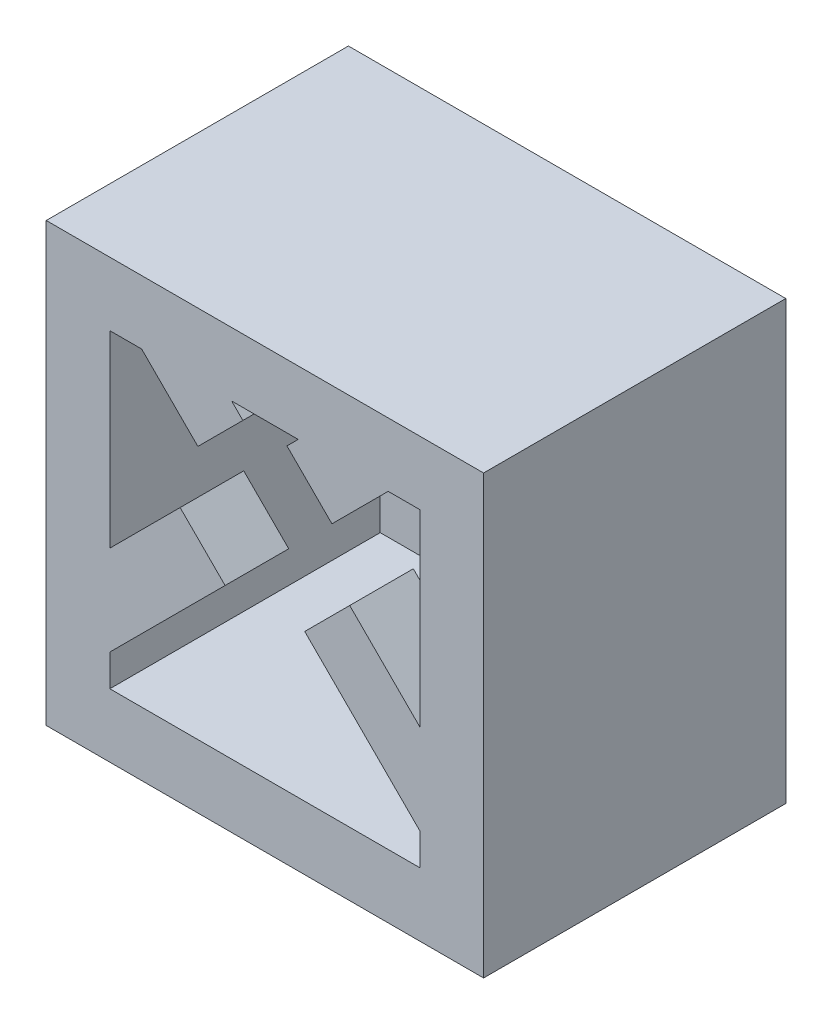
ISO-10303-21;
HEADER;
FILE_DESCRIPTION(('STEP AP214'),'2;1');
FILE_NAME('part.step','',(''),(''),'','','');
FILE_SCHEMA(('AUTOMOTIVE_DESIGN { 1 0 10303 214 1 1 1 1 }'));
ENDSEC;
DATA;
#1=APPLICATION_CONTEXT('core data for automotive mechanical design processes');
#2=APPLICATION_PROTOCOL_DEFINITION('international standard','automotive_design',2000,#1);
#3=PRODUCT_CONTEXT('',#1,'mechanical');
#4=PRODUCT('Part','Part','',(#3));
#5=PRODUCT_RELATED_PRODUCT_CATEGORY('part','',(#4));
#6=PRODUCT_DEFINITION_FORMATION('','',#4);
#7=PRODUCT_DEFINITION_CONTEXT('part definition',#1,'design');
#8=PRODUCT_DEFINITION('design','',#6,#7);
#9=PRODUCT_DEFINITION_SHAPE('','',#8);
#10=(LENGTH_UNIT() NAMED_UNIT(*) SI_UNIT(.MILLI.,.METRE.));
#11=(NAMED_UNIT(*) PLANE_ANGLE_UNIT() SI_UNIT($,.RADIAN.));
#12=(NAMED_UNIT(*) SI_UNIT($,.STERADIAN.) SOLID_ANGLE_UNIT());
#13=UNCERTAINTY_MEASURE_WITH_UNIT(LENGTH_MEASURE(1.E-05),#10,'distance_accuracy_value','');
#14=(GEOMETRIC_REPRESENTATION_CONTEXT(3) GLOBAL_UNCERTAINTY_ASSIGNED_CONTEXT((#13)) GLOBAL_UNIT_ASSIGNED_CONTEXT((#10,
#11,#12)) REPRESENTATION_CONTEXT('',''));
#15=CARTESIAN_POINT('',(0.,0.,0.));
#16=DIRECTION('',(0.,0.,1.));
#17=DIRECTION('',(1.,0.,0.));
#18=AXIS2_PLACEMENT_3D('',#15,#16,#17);
#19=CARTESIAN_POINT('',(0.,0.,1.));
#20=DIRECTION('',(1.,0.,0.));
#21=DIRECTION('',(0.,0.,-1.));
#22=AXIS2_PLACEMENT_3D('',#19,#20,#21);
#23=PLANE('',#22);
#24=DIRECTION('',(0.,-1.,0.));
#25=VECTOR('',#24,1.);
#26=CARTESIAN_POINT('',(0.,0.,0.));
#27=LINE('',#26,#25);
#28=CARTESIAN_POINT('',(0.,13.75,0.));
#29=VERTEX_POINT('',#28);
#30=CARTESIAN_POINT('',(0.,0.,0.));
#31=VERTEX_POINT('',#30);
#32=EDGE_CURVE('E209',#29,#31,#27,.T.);
#33=ORIENTED_EDGE('',*,*,#32,.T.);
#34=DIRECTION('',(0.,0.,-1.));
#35=VECTOR('',#34,1.);
#36=CARTESIAN_POINT('',(0.,0.,1.));
#37=LINE('',#36,#35);
#38=CARTESIAN_POINT('',(0.,0.,9.5));
#39=VERTEX_POINT('',#38);
#40=EDGE_CURVE('E11',#39,#31,#37,.T.);
#41=ORIENTED_EDGE('',*,*,#40,.F.);
#42=DIRECTION('',(0.,-1.,0.));
#43=VECTOR('',#42,1.);
#44=CARTESIAN_POINT('',(0.,13.75,9.5));
#45=LINE('',#44,#43);
#46=CARTESIAN_POINT('',(0.,13.75,9.5));
#47=VERTEX_POINT('',#46);
#48=EDGE_CURVE('E334',#47,#39,#45,.T.);
#49=ORIENTED_EDGE('',*,*,#48,.F.);
#50=DIRECTION('',(0.,0.,-1.));
#51=VECTOR('',#50,1.);
#52=CARTESIAN_POINT('',(0.,13.75,1.));
#53=LINE('',#52,#51);
#54=EDGE_CURVE('E375',#47,#29,#53,.T.);
#55=ORIENTED_EDGE('',*,*,#54,.T.);
#56=EDGE_LOOP('',(#33,#41,#49,#55));
#57=FACE_BOUND('',#56,.T.);
#58=ADVANCED_FACE('F37',(#57),#23,.F.);
#59=CARTESIAN_POINT('',(0.,0.,1.));
#60=DIRECTION('',(0.,1.,0.));
#61=DIRECTION('',(0.,0.,1.));
#62=AXIS2_PLACEMENT_3D('',#59,#60,#61);
#63=PLANE('',#62);
#64=DIRECTION('',(1.,0.,0.));
#65=VECTOR('',#64,1.);
#66=CARTESIAN_POINT('',(0.,0.,0.));
#67=LINE('',#66,#65);
#68=CARTESIAN_POINT('',(13.75,0.,0.));
#69=VERTEX_POINT('',#68);
#70=EDGE_CURVE('E370',#31,#69,#67,.T.);
#71=ORIENTED_EDGE('',*,*,#70,.T.);
#72=DIRECTION('',(0.,0.,-1.));
#73=VECTOR('',#72,1.);
#74=CARTESIAN_POINT('',(13.75,0.,1.));
#75=LINE('',#74,#73);
#76=CARTESIAN_POINT('',(13.75,0.,9.5));
#77=VERTEX_POINT('',#76);
#78=EDGE_CURVE('E44',#77,#69,#75,.T.);
#79=ORIENTED_EDGE('',*,*,#78,.F.);
#80=DIRECTION('',(1.,0.,0.));
#81=VECTOR('',#80,1.);
#82=CARTESIAN_POINT('',(0.,0.,9.5));
#83=LINE('',#82,#81);
#84=EDGE_CURVE('E337',#39,#77,#83,.T.);
#85=ORIENTED_EDGE('',*,*,#84,.F.);
#86=ORIENTED_EDGE('',*,*,#40,.T.);
#87=EDGE_LOOP('',(#71,#79,#85,#86));
#88=FACE_BOUND('',#87,.T.);
#89=ADVANCED_FACE('F393',(#88),#63,.F.);
#90=CARTESIAN_POINT('',(13.75,0.,1.));
#91=DIRECTION('',(-1.,0.,0.));
#92=DIRECTION('',(0.,0.,1.));
#93=AXIS2_PLACEMENT_3D('',#90,#91,#92);
#94=PLANE('',#93);
#95=DIRECTION('',(0.,1.,0.));
#96=VECTOR('',#95,1.);
#97=CARTESIAN_POINT('',(13.75,0.,0.));
#98=LINE('',#97,#96);
#99=CARTESIAN_POINT('',(13.75,13.75,0.));
#100=VERTEX_POINT('',#99);
#101=EDGE_CURVE('E372',#69,#100,#98,.T.);
#102=ORIENTED_EDGE('',*,*,#101,.T.);
#103=DIRECTION('',(0.,0.,-1.));
#104=VECTOR('',#103,1.);
#105=CARTESIAN_POINT('',(13.75,13.75,1.));
#106=LINE('',#105,#104);
#107=CARTESIAN_POINT('',(13.75,13.75,9.5));
#108=VERTEX_POINT('',#107);
#109=EDGE_CURVE('E377',#108,#100,#106,.T.);
#110=ORIENTED_EDGE('',*,*,#109,.F.);
#111=DIRECTION('',(0.,1.,0.));
#112=VECTOR('',#111,1.);
#113=CARTESIAN_POINT('',(13.75,13.75,9.5));
#114=LINE('',#113,#112);
#115=EDGE_CURVE('E340',#77,#108,#114,.T.);
#116=ORIENTED_EDGE('',*,*,#115,.F.);
#117=ORIENTED_EDGE('',*,*,#78,.T.);
#118=EDGE_LOOP('',(#102,#110,#116,#117));
#119=FACE_BOUND('',#118,.T.);
#120=ADVANCED_FACE('F382',(#119),#94,.F.);
#121=CARTESIAN_POINT('',(0.,13.75,1.));
#122=DIRECTION('',(0.,-1.,0.));
#123=DIRECTION('',(0.,0.,-1.));
#124=AXIS2_PLACEMENT_3D('',#121,#122,#123);
#125=PLANE('',#124);
#126=DIRECTION('',(-1.,0.,0.));
#127=VECTOR('',#126,1.);
#128=CARTESIAN_POINT('',(0.,13.75,0.));
#129=LINE('',#128,#127);
#130=EDGE_CURVE('E59',#100,#29,#129,.T.);
#131=ORIENTED_EDGE('',*,*,#130,.T.);
#132=ORIENTED_EDGE('',*,*,#54,.F.);
#133=DIRECTION('',(-1.,0.,0.));
#134=VECTOR('',#133,1.);
#135=CARTESIAN_POINT('',(0.,13.75,9.5));
#136=LINE('',#135,#134);
#137=EDGE_CURVE('E343',#108,#47,#136,.T.);
#138=ORIENTED_EDGE('',*,*,#137,.F.);
#139=ORIENTED_EDGE('',*,*,#109,.T.);
#140=EDGE_LOOP('',(#131,#132,#138,#139));
#141=FACE_BOUND('',#140,.T.);
#142=ADVANCED_FACE('F391',(#141),#125,.F.);
#143=CARTESIAN_POINT('',(0.,0.,0.));
#144=DIRECTION('',(0.,0.,-1.));
#145=DIRECTION('',(-1.,0.,0.));
#146=AXIS2_PLACEMENT_3D('',#143,#144,#145);
#147=PLANE('',#146);
#148=ORIENTED_EDGE('',*,*,#32,.F.);
#149=ORIENTED_EDGE('',*,*,#130,.F.);
#150=ORIENTED_EDGE('',*,*,#101,.F.);
#151=ORIENTED_EDGE('',*,*,#70,.F.);
#152=EDGE_LOOP('',(#148,#149,#150,#151));
#153=FACE_BOUND('',#152,.T.);
#154=ADVANCED_FACE('F387',(#153),#147,.T.);
#155=CARTESIAN_POINT('',(0.,0.,7.5));
#156=DIRECTION('',(0.,0.,1.));
#157=DIRECTION('',(1.,0.,0.));
#158=AXIS2_PLACEMENT_3D('',#155,#156,#157);
#159=PLANE('',#158);
#160=DIRECTION('',(0.,-1.,0.));
#161=VECTOR('',#160,1.);
#162=CARTESIAN_POINT('',(2.,11.75,7.5));
#163=LINE('',#162,#161);
#164=CARTESIAN_POINT('',(2.,5.82842712474619,7.5));
#165=VERTEX_POINT('',#164);
#166=CARTESIAN_POINT('',(2.,3.,7.5));
#167=VERTEX_POINT('',#166);
#168=EDGE_CURVE('E347',#165,#167,#163,.T.);
#169=ORIENTED_EDGE('',*,*,#168,.F.);
#170=DIRECTION('',(0.707106781186547,0.707106781186548,0.));
#171=VECTOR('',#170,1.);
#172=CARTESIAN_POINT('',(4.20926227402443,8.03768939877062,7.5));
#173=LINE('',#172,#171);
#174=CARTESIAN_POINT('',(4.20926227402443,8.03768939877062,7.5));
#175=VERTEX_POINT('',#174);
#176=EDGE_CURVE('E291',#165,#175,#173,.T.);
#177=ORIENTED_EDGE('',*,*,#176,.T.);
#178=DIRECTION('',(0.707106781186547,-0.707106781186547,0.));
#179=VECTOR('',#178,1.);
#180=CARTESIAN_POINT('',(4.20926227402443,8.03768939877062,7.5));
#181=LINE('',#180,#179);
#182=CARTESIAN_POINT('',(5.62347583639753,6.62347583639753,7.5));
#183=VERTEX_POINT('',#182);
#184=EDGE_CURVE('E294',#175,#183,#181,.T.);
#185=ORIENTED_EDGE('',*,*,#184,.T.);
#186=DIRECTION('',(-0.707106781186547,-0.707106781186548,0.));
#187=VECTOR('',#186,1.);
#188=CARTESIAN_POINT('',(2.,3.,7.5));
#189=LINE('',#188,#187);
#190=EDGE_CURVE('E220',#183,#167,#189,.T.);
#191=ORIENTED_EDGE('',*,*,#190,.T.);
#192=EDGE_LOOP('',(#169,#177,#185,#191));
#193=FACE_BOUND('',#192,.T.);
#194=ADVANCED_FACE('F405',(#193),#159,.F.);
#195=DIRECTION('',(-1.,0.,0.));
#196=VECTOR('',#195,1.);
#197=CARTESIAN_POINT('',(2.,11.75,7.5));
#198=LINE('',#197,#196);
#199=CARTESIAN_POINT('',(10.75,11.75,7.5));
#200=VERTEX_POINT('',#199);
#201=CARTESIAN_POINT('',(7.92157287525381,11.75,7.5));
#202=VERTEX_POINT('',#201);
#203=EDGE_CURVE('E356',#200,#202,#198,.T.);
#204=ORIENTED_EDGE('',*,*,#203,.F.);
#205=DIRECTION('',(-0.707106781186548,-0.707106781186547,0.));
#206=VECTOR('',#205,1.);
#207=CARTESIAN_POINT('',(8.98223304703363,9.98223304703363,7.5));
#208=LINE('',#207,#206);
#209=CARTESIAN_POINT('',(8.98223304703363,9.98223304703363,7.5));
#210=VERTEX_POINT('',#209);
#211=EDGE_CURVE('E273',#200,#210,#208,.T.);
#212=ORIENTED_EDGE('',*,*,#211,.T.);
#213=DIRECTION('',(-0.707106781186548,0.707106781186547,0.));
#214=VECTOR('',#213,1.);
#215=CARTESIAN_POINT('',(7.56801948466053,11.3964466094067,7.5));
#216=LINE('',#215,#214);
#217=CARTESIAN_POINT('',(7.56801948466053,11.3964466094067,7.5));
#218=VERTEX_POINT('',#217);
#219=EDGE_CURVE('E276',#210,#218,#216,.T.);
#220=ORIENTED_EDGE('',*,*,#219,.T.);
#221=DIRECTION('',(0.707106781186555,0.70710678118654,0.));
#222=VECTOR('',#221,1.);
#223=CARTESIAN_POINT('',(7.92157287525381,11.75,7.5));
#224=LINE('',#223,#222);
#225=EDGE_CURVE('E279',#218,#202,#224,.T.);
#226=ORIENTED_EDGE('',*,*,#225,.T.);
#227=EDGE_LOOP('',(#204,#212,#220,#226));
#228=FACE_BOUND('',#227,.T.);
#229=ADVANCED_FACE('F505',(#228),#159,.F.);
#230=CARTESIAN_POINT('',(5.82842712474617,11.75,7.5));
#231=VERTEX_POINT('',#230);
#232=CARTESIAN_POINT('',(2.99999999999997,11.75,7.5));
#233=VERTEX_POINT('',#232);
#234=EDGE_CURVE('E353',#231,#233,#198,.T.);
#235=ORIENTED_EDGE('',*,*,#234,.F.);
#236=DIRECTION('',(0.707106781186546,-0.707106781186549,0.));
#237=VECTOR('',#236,1.);
#238=CARTESIAN_POINT('',(5.82842712474617,11.75,7.5));
#239=LINE('',#238,#237);
#240=CARTESIAN_POINT('',(6.18198051533944,11.3964466094067,7.5));
#241=VERTEX_POINT('',#240);
#242=EDGE_CURVE('E282',#231,#241,#239,.T.);
#243=ORIENTED_EDGE('',*,*,#242,.T.);
#244=DIRECTION('',(-0.707106781186545,-0.70710678118655,0.));
#245=VECTOR('',#244,1.);
#246=CARTESIAN_POINT('',(6.18198051533944,11.3964466094067,7.5));
#247=LINE('',#246,#245);
#248=CARTESIAN_POINT('',(4.76776695296636,9.98223304703363,7.5));
#249=VERTEX_POINT('',#248);
#250=EDGE_CURVE('E285',#241,#249,#247,.T.);
#251=ORIENTED_EDGE('',*,*,#250,.T.);
#252=DIRECTION('',(-0.707106781186551,0.707106781186544,0.));
#253=VECTOR('',#252,1.);
#254=CARTESIAN_POINT('',(4.76776695296636,9.98223304703363,7.5));
#255=LINE('',#254,#253);
#256=EDGE_CURVE('E288',#249,#233,#255,.T.);
#257=ORIENTED_EDGE('',*,*,#256,.T.);
#258=EDGE_LOOP('',(#235,#243,#251,#257));
#259=FACE_BOUND('',#258,.T.);
#260=ADVANCED_FACE('F427',(#259),#159,.F.);
#261=CARTESIAN_POINT('',(0.,0.,9.5));
#262=DIRECTION('',(0.,0.,1.));
#263=DIRECTION('',(1.,0.,0.));
#264=AXIS2_PLACEMENT_3D('',#261,#262,#263);
#265=PLANE('',#264);
#266=ORIENTED_EDGE('',*,*,#48,.T.);
#267=ORIENTED_EDGE('',*,*,#84,.T.);
#268=ORIENTED_EDGE('',*,*,#115,.T.);
#269=ORIENTED_EDGE('',*,*,#137,.T.);
#270=EDGE_LOOP('',(#266,#267,#268,#269));
#271=FACE_BOUND('',#270,.T.);
#272=DIRECTION('',(1.,0.,0.));
#273=VECTOR('',#272,1.);
#274=CARTESIAN_POINT('',(2.,2.,9.5));
#275=LINE('',#274,#273);
#276=CARTESIAN_POINT('',(2.,2.,9.5));
#277=VERTEX_POINT('',#276);
#278=CARTESIAN_POINT('',(11.75,2.,9.5));
#279=VERTEX_POINT('',#278);
#280=EDGE_CURVE('E203',#277,#279,#275,.T.);
#281=ORIENTED_EDGE('',*,*,#280,.F.);
#282=DIRECTION('',(0.,-1.,0.));
#283=VECTOR('',#282,1.);
#284=CARTESIAN_POINT('',(2.,3.,9.5));
#285=LINE('',#284,#283);
#286=CARTESIAN_POINT('',(2.,3.,9.5));
#287=VERTEX_POINT('',#286);
#288=EDGE_CURVE('E214',#287,#277,#285,.T.);
#289=ORIENTED_EDGE('',*,*,#288,.F.);
#290=DIRECTION('',(-0.707106781186547,-0.707106781186548,0.));
#291=VECTOR('',#290,1.);
#292=CARTESIAN_POINT('',(2.,3.,9.5));
#293=LINE('',#292,#291);
#294=CARTESIAN_POINT('',(5.62347583639753,6.62347583639753,9.5));
#295=VERTEX_POINT('',#294);
#296=EDGE_CURVE('E262',#295,#287,#293,.T.);
#297=ORIENTED_EDGE('',*,*,#296,.F.);
#298=DIRECTION('',(0.707106781186547,-0.707106781186547,0.));
#299=VECTOR('',#298,1.);
#300=CARTESIAN_POINT('',(4.20926227402443,8.03768939877062,9.5));
#301=LINE('',#300,#299);
#302=CARTESIAN_POINT('',(4.20926227402443,8.03768939877062,9.5));
#303=VERTEX_POINT('',#302);
#304=EDGE_CURVE('E259',#303,#295,#301,.T.);
#305=ORIENTED_EDGE('',*,*,#304,.F.);
#306=DIRECTION('',(0.707106781186547,0.707106781186548,0.));
#307=VECTOR('',#306,1.);
#308=CARTESIAN_POINT('',(4.20926227402443,8.03768939877062,9.5));
#309=LINE('',#308,#307);
#310=CARTESIAN_POINT('',(2.,5.82842712474619,9.5));
#311=VERTEX_POINT('',#310);
#312=EDGE_CURVE('E257',#311,#303,#309,.T.);
#313=ORIENTED_EDGE('',*,*,#312,.F.);
#314=DIRECTION('',(0.,-1.,0.));
#315=VECTOR('',#314,1.);
#316=CARTESIAN_POINT('',(2.,11.75,9.5));
#317=LINE('',#316,#315);
#318=CARTESIAN_POINT('',(2.,11.75,9.5));
#319=VERTEX_POINT('',#318);
#320=EDGE_CURVE('E255',#319,#311,#317,.T.);
#321=ORIENTED_EDGE('',*,*,#320,.F.);
#322=DIRECTION('',(-1.,0.,0.));
#323=VECTOR('',#322,1.);
#324=CARTESIAN_POINT('',(2.99999999999997,11.75,9.5));
#325=LINE('',#324,#323);
#326=CARTESIAN_POINT('',(2.99999999999997,11.75,9.5));
#327=VERTEX_POINT('',#326);
#328=EDGE_CURVE('E253',#327,#319,#325,.T.);
#329=ORIENTED_EDGE('',*,*,#328,.F.);
#330=DIRECTION('',(-0.707106781186551,0.707106781186544,0.));
#331=VECTOR('',#330,1.);
#332=CARTESIAN_POINT('',(4.76776695296636,9.98223304703363,9.5));
#333=LINE('',#332,#331);
#334=CARTESIAN_POINT('',(4.76776695296636,9.98223304703363,9.5));
#335=VERTEX_POINT('',#334);
#336=EDGE_CURVE('E251',#335,#327,#333,.T.);
#337=ORIENTED_EDGE('',*,*,#336,.F.);
#338=DIRECTION('',(-0.707106781186545,-0.70710678118655,0.));
#339=VECTOR('',#338,1.);
#340=CARTESIAN_POINT('',(6.18198051533944,11.3964466094067,9.5));
#341=LINE('',#340,#339);
#342=CARTESIAN_POINT('',(6.18198051533944,11.3964466094067,9.5));
#343=VERTEX_POINT('',#342);
#344=EDGE_CURVE('E249',#343,#335,#341,.T.);
#345=ORIENTED_EDGE('',*,*,#344,.F.);
#346=DIRECTION('',(0.707106781186546,-0.707106781186549,0.));
#347=VECTOR('',#346,1.);
#348=CARTESIAN_POINT('',(5.82842712474617,11.75,9.5));
#349=LINE('',#348,#347);
#350=CARTESIAN_POINT('',(5.82842712474617,11.75,9.5));
#351=VERTEX_POINT('',#350);
#352=EDGE_CURVE('E247',#351,#343,#349,.T.);
#353=ORIENTED_EDGE('',*,*,#352,.F.);
#354=DIRECTION('',(-1.,0.,0.));
#355=VECTOR('',#354,1.);
#356=CARTESIAN_POINT('',(5.82842712474617,11.75,9.5));
#357=LINE('',#356,#355);
#358=CARTESIAN_POINT('',(7.92157287525381,11.75,9.5));
#359=VERTEX_POINT('',#358);
#360=EDGE_CURVE('E245',#359,#351,#357,.T.);
#361=ORIENTED_EDGE('',*,*,#360,.F.);
#362=DIRECTION('',(0.707106781186555,0.70710678118654,0.));
#363=VECTOR('',#362,1.);
#364=CARTESIAN_POINT('',(7.92157287525381,11.75,9.5));
#365=LINE('',#364,#363);
#366=CARTESIAN_POINT('',(7.56801948466053,11.3964466094067,9.5));
#367=VERTEX_POINT('',#366);
#368=EDGE_CURVE('E243',#367,#359,#365,.T.);
#369=ORIENTED_EDGE('',*,*,#368,.F.);
#370=DIRECTION('',(-0.707106781186548,0.707106781186547,0.));
#371=VECTOR('',#370,1.);
#372=CARTESIAN_POINT('',(7.56801948466053,11.3964466094067,9.5));
#373=LINE('',#372,#371);
#374=CARTESIAN_POINT('',(8.98223304703363,9.98223304703363,9.5));
#375=VERTEX_POINT('',#374);
#376=EDGE_CURVE('E241',#375,#367,#373,.T.);
#377=ORIENTED_EDGE('',*,*,#376,.F.);
#378=DIRECTION('',(-0.707106781186548,-0.707106781186547,0.));
#379=VECTOR('',#378,1.);
#380=CARTESIAN_POINT('',(8.98223304703363,9.98223304703363,9.5));
#381=LINE('',#380,#379);
#382=CARTESIAN_POINT('',(10.75,11.75,9.5));
#383=VERTEX_POINT('',#382);
#384=EDGE_CURVE('E239',#383,#375,#381,.T.);
#385=ORIENTED_EDGE('',*,*,#384,.F.);
#386=DIRECTION('',(-1.,0.,0.));
#387=VECTOR('',#386,1.);
#388=CARTESIAN_POINT('',(11.75,11.75,9.5));
#389=LINE('',#388,#387);
#390=CARTESIAN_POINT('',(11.75,11.75,9.5));
#391=VERTEX_POINT('',#390);
#392=EDGE_CURVE('E237',#391,#383,#389,.T.);
#393=ORIENTED_EDGE('',*,*,#392,.F.);
#394=DIRECTION('',(0.,1.,0.));
#395=VECTOR('',#394,1.);
#396=CARTESIAN_POINT('',(11.75,5.82842712474619,9.5));
#397=LINE('',#396,#395);
#398=CARTESIAN_POINT('',(11.75,5.82842712474619,9.5));
#399=VERTEX_POINT('',#398);
#400=EDGE_CURVE('E234',#399,#391,#397,.T.);
#401=ORIENTED_EDGE('',*,*,#400,.F.);
#402=DIRECTION('',(0.707106781186549,-0.707106781186546,0.));
#403=VECTOR('',#402,1.);
#404=CARTESIAN_POINT('',(11.75,5.82842712474619,9.5));
#405=LINE('',#404,#403);
#406=CARTESIAN_POINT('',(9.54073772597556,8.03768939877062,9.5));
#407=VERTEX_POINT('',#406);
#408=EDGE_CURVE('E232',#407,#399,#405,.T.);
#409=ORIENTED_EDGE('',*,*,#408,.F.);
#410=DIRECTION('',(0.707106781186545,0.70710678118655,0.));
#411=VECTOR('',#410,1.);
#412=CARTESIAN_POINT('',(9.54073772597556,8.03768939877062,9.5));
#413=LINE('',#412,#411);
#414=CARTESIAN_POINT('',(8.12652416360247,6.62347583639752,9.5));
#415=VERTEX_POINT('',#414);
#416=EDGE_CURVE('E230',#415,#407,#413,.T.);
#417=ORIENTED_EDGE('',*,*,#416,.F.);
#418=DIRECTION('',(-0.707106781186548,0.707106781186547,0.));
#419=VECTOR('',#418,1.);
#420=CARTESIAN_POINT('',(11.75,3.,9.5));
#421=LINE('',#420,#419);
#422=CARTESIAN_POINT('',(11.75,3.,9.5));
#423=VERTEX_POINT('',#422);
#424=EDGE_CURVE('E226',#423,#415,#421,.T.);
#425=ORIENTED_EDGE('',*,*,#424,.F.);
#426=DIRECTION('',(0.,1.,0.));
#427=VECTOR('',#426,1.);
#428=CARTESIAN_POINT('',(11.75,2.,9.5));
#429=LINE('',#428,#427);
#430=EDGE_CURVE('E224',#279,#423,#429,.T.);
#431=ORIENTED_EDGE('',*,*,#430,.F.);
#432=EDGE_LOOP('',(#281,#289,#297,#305,#313,#321,#329,#337,#345,#353,#361,#369,#377,#385,#393,
#401,#409,#417,#425,#431));
#433=FACE_BOUND('',#432,.T.);
#434=ADVANCED_FACE('F222',(#271,#433),#265,.T.);
#435=DIRECTION('',(0.,1.,0.));
#436=VECTOR('',#435,1.);
#437=CARTESIAN_POINT('',(11.75,11.75,7.5));
#438=LINE('',#437,#436);
#439=CARTESIAN_POINT('',(11.75,3.,7.5));
#440=VERTEX_POINT('',#439);
#441=CARTESIAN_POINT('',(11.75,5.82842712474619,7.5));
#442=VERTEX_POINT('',#441);
#443=EDGE_CURVE('E349',#440,#442,#438,.T.);
#444=ORIENTED_EDGE('',*,*,#443,.F.);
#445=DIRECTION('',(-0.707106781186548,0.707106781186547,0.));
#446=VECTOR('',#445,1.);
#447=CARTESIAN_POINT('',(11.75,3.,7.5));
#448=LINE('',#447,#446);
#449=CARTESIAN_POINT('',(8.12652416360247,6.62347583639752,7.5));
#450=VERTEX_POINT('',#449);
#451=EDGE_CURVE('E264',#440,#450,#448,.T.);
#452=ORIENTED_EDGE('',*,*,#451,.T.);
#453=DIRECTION('',(0.707106781186545,0.70710678118655,0.));
#454=VECTOR('',#453,1.);
#455=CARTESIAN_POINT('',(9.54073772597556,8.03768939877062,7.5));
#456=LINE('',#455,#454);
#457=CARTESIAN_POINT('',(9.54073772597556,8.03768939877062,7.5));
#458=VERTEX_POINT('',#457);
#459=EDGE_CURVE('E267',#450,#458,#456,.T.);
#460=ORIENTED_EDGE('',*,*,#459,.T.);
#461=DIRECTION('',(0.707106781186549,-0.707106781186546,0.));
#462=VECTOR('',#461,1.);
#463=CARTESIAN_POINT('',(11.75,5.82842712474619,7.5));
#464=LINE('',#463,#462);
#465=EDGE_CURVE('E270',#458,#442,#464,.T.);
#466=ORIENTED_EDGE('',*,*,#465,.T.);
#467=EDGE_LOOP('',(#444,#452,#460,#466));
#468=FACE_BOUND('',#467,.T.);
#469=ADVANCED_FACE('F422',(#468),#159,.F.);
#470=CARTESIAN_POINT('',(11.75,3.,9.5));
#471=DIRECTION('',(-0.707106781186547,-0.707106781186548,0.));
#472=DIRECTION('',(0.707106781186548,-0.707106781186547,0.));
#473=AXIS2_PLACEMENT_3D('',#470,#471,#472);
#474=PLANE('',#473);
#475=ORIENTED_EDGE('',*,*,#451,.F.);
#476=DIRECTION('',(0.,0.,-1.));
#477=VECTOR('',#476,1.);
#478=CARTESIAN_POINT('',(11.75,3.,9.5));
#479=LINE('',#478,#477);
#480=EDGE_CURVE('E331',#423,#440,#479,.T.);
#481=ORIENTED_EDGE('',*,*,#480,.F.);
#482=ORIENTED_EDGE('',*,*,#424,.T.);
#483=DIRECTION('',(0.,0.,-1.));
#484=VECTOR('',#483,1.);
#485=CARTESIAN_POINT('',(8.12652416360247,6.62347583639752,9.5));
#486=LINE('',#485,#484);
#487=EDGE_CURVE('E329',#415,#450,#486,.T.);
#488=ORIENTED_EDGE('',*,*,#487,.T.);
#489=EDGE_LOOP('',(#475,#481,#482,#488));
#490=FACE_BOUND('',#489,.T.);
#491=ADVANCED_FACE('F425',(#490),#474,.T.);
#492=CARTESIAN_POINT('',(9.54073772597556,8.03768939877062,9.5));
#493=DIRECTION('',(-0.70710678118655,0.707106781186545,0.));
#494=DIRECTION('',(-0.707106781186545,-0.70710678118655,0.));
#495=AXIS2_PLACEMENT_3D('',#492,#493,#494);
#496=PLANE('',#495);
#497=ORIENTED_EDGE('',*,*,#459,.F.);
#498=ORIENTED_EDGE('',*,*,#487,.F.);
#499=ORIENTED_EDGE('',*,*,#416,.T.);
#500=DIRECTION('',(0.,0.,-1.));
#501=VECTOR('',#500,1.);
#502=CARTESIAN_POINT('',(9.54073772597556,8.03768939877062,9.5));
#503=LINE('',#502,#501);
#504=EDGE_CURVE('E327',#407,#458,#503,.T.);
#505=ORIENTED_EDGE('',*,*,#504,.T.);
#506=EDGE_LOOP('',(#497,#498,#499,#505));
#507=FACE_BOUND('',#506,.T.);
#508=ADVANCED_FACE('F432',(#507),#496,.T.);
#509=CARTESIAN_POINT('',(11.75,5.82842712474619,9.5));
#510=DIRECTION('',(0.707106781186546,0.707106781186549,0.));
#511=DIRECTION('',(-0.707106781186549,0.707106781186546,0.));
#512=AXIS2_PLACEMENT_3D('',#509,#510,#511);
#513=PLANE('',#512);
#514=ORIENTED_EDGE('',*,*,#465,.F.);
#515=ORIENTED_EDGE('',*,*,#504,.F.);
#516=ORIENTED_EDGE('',*,*,#408,.T.);
#517=DIRECTION('',(0.,0.,-1.));
#518=VECTOR('',#517,1.);
#519=CARTESIAN_POINT('',(11.75,5.82842712474619,9.5));
#520=LINE('',#519,#518);
#521=EDGE_CURVE('E325',#399,#442,#520,.T.);
#522=ORIENTED_EDGE('',*,*,#521,.T.);
#523=EDGE_LOOP('',(#514,#515,#516,#522));
#524=FACE_BOUND('',#523,.T.);
#525=ADVANCED_FACE('F436',(#524),#513,.T.);
#526=CARTESIAN_POINT('',(8.98223304703363,9.98223304703363,9.5));
#527=DIRECTION('',(0.707106781186547,-0.707106781186548,0.));
#528=DIRECTION('',(0.707106781186548,0.707106781186547,0.));
#529=AXIS2_PLACEMENT_3D('',#526,#527,#528);
#530=PLANE('',#529);
#531=ORIENTED_EDGE('',*,*,#211,.F.);
#532=DIRECTION('',(0.,0.,-1.));
#533=VECTOR('',#532,1.);
#534=CARTESIAN_POINT('',(10.75,11.75,9.5));
#535=LINE('',#534,#533);
#536=EDGE_CURVE('E322',#383,#200,#535,.T.);
#537=ORIENTED_EDGE('',*,*,#536,.F.);
#538=ORIENTED_EDGE('',*,*,#384,.T.);
#539=DIRECTION('',(0.,0.,-1.));
#540=VECTOR('',#539,1.);
#541=CARTESIAN_POINT('',(8.98223304703363,9.98223304703363,9.5));
#542=LINE('',#541,#540);
#543=EDGE_CURVE('E320',#375,#210,#542,.T.);
#544=ORIENTED_EDGE('',*,*,#543,.T.);
#545=EDGE_LOOP('',(#531,#537,#538,#544));
#546=FACE_BOUND('',#545,.T.);
#547=ADVANCED_FACE('F440',(#546),#530,.T.);
#548=CARTESIAN_POINT('',(7.56801948466053,11.3964466094067,9.5));
#549=DIRECTION('',(-0.707106781186547,-0.707106781186548,0.));
#550=DIRECTION('',(0.707106781186548,-0.707106781186547,0.));
#551=AXIS2_PLACEMENT_3D('',#548,#549,#550);
#552=PLANE('',#551);
#553=ORIENTED_EDGE('',*,*,#219,.F.);
#554=ORIENTED_EDGE('',*,*,#543,.F.);
#555=ORIENTED_EDGE('',*,*,#376,.T.);
#556=DIRECTION('',(0.,0.,-1.));
#557=VECTOR('',#556,1.);
#558=CARTESIAN_POINT('',(7.56801948466053,11.3964466094067,9.5));
#559=LINE('',#558,#557);
#560=EDGE_CURVE('E318',#367,#218,#559,.T.);
#561=ORIENTED_EDGE('',*,*,#560,.T.);
#562=EDGE_LOOP('',(#553,#554,#555,#561));
#563=FACE_BOUND('',#562,.T.);
#564=ADVANCED_FACE('F444',(#563),#552,.T.);
#565=CARTESIAN_POINT('',(7.92157287525381,11.75,9.5));
#566=DIRECTION('',(-0.70710678118654,0.707106781186555,0.));
#567=DIRECTION('',(-0.707106781186555,-0.70710678118654,0.));
#568=AXIS2_PLACEMENT_3D('',#565,#566,#567);
#569=PLANE('',#568);
#570=ORIENTED_EDGE('',*,*,#225,.F.);
#571=ORIENTED_EDGE('',*,*,#560,.F.);
#572=ORIENTED_EDGE('',*,*,#368,.T.);
#573=DIRECTION('',(0.,0.,-1.));
#574=VECTOR('',#573,1.);
#575=CARTESIAN_POINT('',(7.92157287525381,11.75,9.5));
#576=LINE('',#575,#574);
#577=EDGE_CURVE('E316',#359,#202,#576,.T.);
#578=ORIENTED_EDGE('',*,*,#577,.T.);
#579=EDGE_LOOP('',(#570,#571,#572,#578));
#580=FACE_BOUND('',#579,.T.);
#581=ADVANCED_FACE('F448',(#580),#569,.T.);
#582=CARTESIAN_POINT('',(5.82842712474617,11.75,9.5));
#583=DIRECTION('',(0.707106781186549,0.707106781186546,0.));
#584=DIRECTION('',(-0.707106781186546,0.707106781186549,0.));
#585=AXIS2_PLACEMENT_3D('',#582,#583,#584);
#586=PLANE('',#585);
#587=ORIENTED_EDGE('',*,*,#242,.F.);
#588=DIRECTION('',(0.,0.,-1.));
#589=VECTOR('',#588,1.);
#590=CARTESIAN_POINT('',(5.82842712474617,11.75,9.5));
#591=LINE('',#590,#589);
#592=EDGE_CURVE('E313',#351,#231,#591,.T.);
#593=ORIENTED_EDGE('',*,*,#592,.F.);
#594=ORIENTED_EDGE('',*,*,#352,.T.);
#595=DIRECTION('',(0.,0.,-1.));
#596=VECTOR('',#595,1.);
#597=CARTESIAN_POINT('',(6.18198051533944,11.3964466094067,9.5));
#598=LINE('',#597,#596);
#599=EDGE_CURVE('E311',#343,#241,#598,.T.);
#600=ORIENTED_EDGE('',*,*,#599,.T.);
#601=EDGE_LOOP('',(#587,#593,#594,#600));
#602=FACE_BOUND('',#601,.T.);
#603=ADVANCED_FACE('F452',(#602),#586,.T.);
#604=CARTESIAN_POINT('',(6.18198051533944,11.3964466094067,9.5));
#605=DIRECTION('',(0.70710678118655,-0.707106781186545,0.));
#606=DIRECTION('',(0.707106781186545,0.70710678118655,0.));
#607=AXIS2_PLACEMENT_3D('',#604,#605,#606);
#608=PLANE('',#607);
#609=ORIENTED_EDGE('',*,*,#250,.F.);
#610=ORIENTED_EDGE('',*,*,#599,.F.);
#611=ORIENTED_EDGE('',*,*,#344,.T.);
#612=DIRECTION('',(0.,0.,-1.));
#613=VECTOR('',#612,1.);
#614=CARTESIAN_POINT('',(4.76776695296636,9.98223304703363,9.5));
#615=LINE('',#614,#613);
#616=EDGE_CURVE('E309',#335,#249,#615,.T.);
#617=ORIENTED_EDGE('',*,*,#616,.T.);
#618=EDGE_LOOP('',(#609,#610,#611,#617));
#619=FACE_BOUND('',#618,.T.);
#620=ADVANCED_FACE('F456',(#619),#608,.T.);
#621=CARTESIAN_POINT('',(4.76776695296636,9.98223304703363,9.5));
#622=DIRECTION('',(-0.707106781186544,-0.707106781186551,0.));
#623=DIRECTION('',(0.707106781186551,-0.707106781186544,0.));
#624=AXIS2_PLACEMENT_3D('',#621,#622,#623);
#625=PLANE('',#624);
#626=ORIENTED_EDGE('',*,*,#256,.F.);
#627=ORIENTED_EDGE('',*,*,#616,.F.);
#628=ORIENTED_EDGE('',*,*,#336,.T.);
#629=DIRECTION('',(0.,0.,-1.));
#630=VECTOR('',#629,1.);
#631=CARTESIAN_POINT('',(2.99999999999997,11.75,9.5));
#632=LINE('',#631,#630);
#633=EDGE_CURVE('E307',#327,#233,#632,.T.);
#634=ORIENTED_EDGE('',*,*,#633,.T.);
#635=EDGE_LOOP('',(#626,#627,#628,#634));
#636=FACE_BOUND('',#635,.T.);
#637=ADVANCED_FACE('F460',(#636),#625,.T.);
#638=CARTESIAN_POINT('',(4.20926227402443,8.03768939877062,9.5));
#639=DIRECTION('',(-0.707106781186548,0.707106781186547,0.));
#640=DIRECTION('',(-0.707106781186547,-0.707106781186548,0.));
#641=AXIS2_PLACEMENT_3D('',#638,#639,#640);
#642=PLANE('',#641);
#643=ORIENTED_EDGE('',*,*,#176,.F.);
#644=DIRECTION('',(0.,0.,-1.));
#645=VECTOR('',#644,1.);
#646=CARTESIAN_POINT('',(2.,5.82842712474619,9.5));
#647=LINE('',#646,#645);
#648=EDGE_CURVE('E304',#311,#165,#647,.T.);
#649=ORIENTED_EDGE('',*,*,#648,.F.);
#650=ORIENTED_EDGE('',*,*,#312,.T.);
#651=DIRECTION('',(0.,0.,-1.));
#652=VECTOR('',#651,1.);
#653=CARTESIAN_POINT('',(4.20926227402443,8.03768939877062,9.5));
#654=LINE('',#653,#652);
#655=EDGE_CURVE('E302',#303,#175,#654,.T.);
#656=ORIENTED_EDGE('',*,*,#655,.T.);
#657=EDGE_LOOP('',(#643,#649,#650,#656));
#658=FACE_BOUND('',#657,.T.);
#659=ADVANCED_FACE('F464',(#658),#642,.T.);
#660=CARTESIAN_POINT('',(4.20926227402443,8.03768939877062,9.5));
#661=DIRECTION('',(0.707106781186547,0.707106781186547,0.));
#662=DIRECTION('',(-0.707106781186548,0.707106781186548,0.));
#663=AXIS2_PLACEMENT_3D('',#660,#661,#662);
#664=PLANE('',#663);
#665=ORIENTED_EDGE('',*,*,#184,.F.);
#666=ORIENTED_EDGE('',*,*,#655,.F.);
#667=ORIENTED_EDGE('',*,*,#304,.T.);
#668=DIRECTION('',(0.,0.,-1.));
#669=VECTOR('',#668,1.);
#670=CARTESIAN_POINT('',(5.62347583639753,6.62347583639753,9.5));
#671=LINE('',#670,#669);
#672=EDGE_CURVE('E300',#295,#183,#671,.T.);
#673=ORIENTED_EDGE('',*,*,#672,.T.);
#674=EDGE_LOOP('',(#665,#666,#667,#673));
#675=FACE_BOUND('',#674,.T.);
#676=ADVANCED_FACE('F468',(#675),#664,.T.);
#677=CARTESIAN_POINT('',(2.,3.,9.5));
#678=DIRECTION('',(0.707106781186548,-0.707106781186547,0.));
#679=DIRECTION('',(0.707106781186547,0.707106781186548,0.));
#680=AXIS2_PLACEMENT_3D('',#677,#678,#679);
#681=PLANE('',#680);
#682=ORIENTED_EDGE('',*,*,#190,.F.);
#683=ORIENTED_EDGE('',*,*,#672,.F.);
#684=ORIENTED_EDGE('',*,*,#296,.T.);
#685=DIRECTION('',(0.,0.,-1.));
#686=VECTOR('',#685,1.);
#687=CARTESIAN_POINT('',(2.,3.,9.5));
#688=LINE('',#687,#686);
#689=EDGE_CURVE('E217',#287,#167,#688,.T.);
#690=ORIENTED_EDGE('',*,*,#689,.T.);
#691=EDGE_LOOP('',(#682,#683,#684,#690));
#692=FACE_BOUND('',#691,.T.);
#693=ADVANCED_FACE('F410',(#692),#681,.T.);
#694=CARTESIAN_POINT('',(0.,0.,1.));
#695=DIRECTION('',(0.,0.,-1.));
#696=DIRECTION('',(-1.,0.,0.));
#697=AXIS2_PLACEMENT_3D('',#694,#695,#696);
#698=PLANE('',#697);
#699=DIRECTION('',(-1.,0.,0.));
#700=VECTOR('',#699,1.);
#701=CARTESIAN_POINT('',(2.,11.75,1.));
#702=LINE('',#701,#700);
#703=CARTESIAN_POINT('',(11.75,11.75,1.));
#704=VERTEX_POINT('',#703);
#705=CARTESIAN_POINT('',(2.,11.75,1.));
#706=VERTEX_POINT('',#705);
#707=EDGE_CURVE('E350',#704,#706,#702,.T.);
#708=ORIENTED_EDGE('',*,*,#707,.T.);
#709=DIRECTION('',(0.,-1.,0.));
#710=VECTOR('',#709,1.);
#711=CARTESIAN_POINT('',(2.,11.75,1.));
#712=LINE('',#711,#710);
#713=CARTESIAN_POINT('',(2.,2.,1.));
#714=VERTEX_POINT('',#713);
#715=EDGE_CURVE('E346',#706,#714,#712,.T.);
#716=ORIENTED_EDGE('',*,*,#715,.T.);
#717=DIRECTION('',(1.,0.,0.));
#718=VECTOR('',#717,1.);
#719=CARTESIAN_POINT('',(2.,2.,1.));
#720=LINE('',#719,#718);
#721=CARTESIAN_POINT('',(11.75,2.,1.));
#722=VERTEX_POINT('',#721);
#723=EDGE_CURVE('E206',#714,#722,#720,.T.);
#724=ORIENTED_EDGE('',*,*,#723,.T.);
#725=DIRECTION('',(0.,1.,0.));
#726=VECTOR('',#725,1.);
#727=CARTESIAN_POINT('',(11.75,11.75,1.));
#728=LINE('',#727,#726);
#729=EDGE_CURVE('E359',#722,#704,#728,.T.);
#730=ORIENTED_EDGE('',*,*,#729,.T.);
#731=EDGE_LOOP('',(#708,#716,#724,#730));
#732=FACE_BOUND('',#731,.T.);
#733=ADVANCED_FACE('F406',(#732),#698,.F.);
#734=CARTESIAN_POINT('',(11.75,11.75,7.5));
#735=DIRECTION('',(-1.,0.,0.));
#736=DIRECTION('',(0.,-1.,0.));
#737=AXIS2_PLACEMENT_3D('',#734,#735,#736);
#738=PLANE('',#737);
#739=ORIENTED_EDGE('',*,*,#729,.F.);
#740=DIRECTION('',(0.,0.,-1.));
#741=VECTOR('',#740,1.);
#742=CARTESIAN_POINT('',(11.75,2.,7.5));
#743=LINE('',#742,#741);
#744=EDGE_CURVE('E210',#279,#722,#743,.T.);
#745=ORIENTED_EDGE('',*,*,#744,.F.);
#746=ORIENTED_EDGE('',*,*,#430,.T.);
#747=ORIENTED_EDGE('',*,*,#480,.T.);
#748=ORIENTED_EDGE('',*,*,#443,.T.);
#749=ORIENTED_EDGE('',*,*,#521,.F.);
#750=ORIENTED_EDGE('',*,*,#400,.T.);
#751=DIRECTION('',(0.,0.,-1.));
#752=VECTOR('',#751,1.);
#753=CARTESIAN_POINT('',(11.75,11.75,7.5));
#754=LINE('',#753,#752);
#755=EDGE_CURVE('E365',#391,#704,#754,.T.);
#756=ORIENTED_EDGE('',*,*,#755,.T.);
#757=EDGE_LOOP('',(#739,#745,#746,#747,#748,#749,#750,#756));
#758=FACE_BOUND('',#757,.T.);
#759=ADVANCED_FACE('F409',(#758),#738,.T.);
#760=CARTESIAN_POINT('',(2.,11.75,7.5));
#761=DIRECTION('',(0.,-1.,0.));
#762=DIRECTION('',(0.,0.,-1.));
#763=AXIS2_PLACEMENT_3D('',#760,#761,#762);
#764=PLANE('',#763);
#765=ORIENTED_EDGE('',*,*,#707,.F.);
#766=ORIENTED_EDGE('',*,*,#755,.F.);
#767=ORIENTED_EDGE('',*,*,#392,.T.);
#768=ORIENTED_EDGE('',*,*,#536,.T.);
#769=ORIENTED_EDGE('',*,*,#203,.T.);
#770=ORIENTED_EDGE('',*,*,#577,.F.);
#771=ORIENTED_EDGE('',*,*,#360,.T.);
#772=ORIENTED_EDGE('',*,*,#592,.T.);
#773=ORIENTED_EDGE('',*,*,#234,.T.);
#774=ORIENTED_EDGE('',*,*,#633,.F.);
#775=ORIENTED_EDGE('',*,*,#328,.T.);
#776=DIRECTION('',(0.,0.,-1.));
#777=VECTOR('',#776,1.);
#778=CARTESIAN_POINT('',(2.,11.75,7.5));
#779=LINE('',#778,#777);
#780=EDGE_CURVE('E51',#319,#706,#779,.T.);
#781=ORIENTED_EDGE('',*,*,#780,.T.);
#782=EDGE_LOOP('',(#765,#766,#767,#768,#769,#770,#771,#772,#773,#774,#775,#781));
#783=FACE_BOUND('',#782,.T.);
#784=ADVANCED_FACE('F414',(#783),#764,.T.);
#785=CARTESIAN_POINT('',(2.,11.75,7.5));
#786=DIRECTION('',(1.,0.,0.));
#787=DIRECTION('',(0.,1.,0.));
#788=AXIS2_PLACEMENT_3D('',#785,#786,#787);
#789=PLANE('',#788);
#790=ORIENTED_EDGE('',*,*,#715,.F.);
#791=ORIENTED_EDGE('',*,*,#780,.F.);
#792=ORIENTED_EDGE('',*,*,#320,.T.);
#793=ORIENTED_EDGE('',*,*,#648,.T.);
#794=ORIENTED_EDGE('',*,*,#168,.T.);
#795=ORIENTED_EDGE('',*,*,#689,.F.);
#796=ORIENTED_EDGE('',*,*,#288,.T.);
#797=DIRECTION('',(0.,0.,-1.));
#798=VECTOR('',#797,1.);
#799=CARTESIAN_POINT('',(2.,2.,7.5));
#800=LINE('',#799,#798);
#801=EDGE_CURVE('E199',#277,#714,#800,.T.);
#802=ORIENTED_EDGE('',*,*,#801,.T.);
#803=EDGE_LOOP('',(#790,#791,#792,#793,#794,#795,#796,#802));
#804=FACE_BOUND('',#803,.T.);
#805=ADVANCED_FACE('F215',(#804),#789,.T.);
#806=CARTESIAN_POINT('',(2.,2.,7.5));
#807=DIRECTION('',(0.,1.,0.));
#808=DIRECTION('',(0.,0.,1.));
#809=AXIS2_PLACEMENT_3D('',#806,#807,#808);
#810=PLANE('',#809);
#811=ORIENTED_EDGE('',*,*,#723,.F.);
#812=ORIENTED_EDGE('',*,*,#801,.F.);
#813=ORIENTED_EDGE('',*,*,#280,.T.);
#814=ORIENTED_EDGE('',*,*,#744,.T.);
#815=EDGE_LOOP('',(#811,#812,#813,#814));
#816=FACE_BOUND('',#815,.T.);
#817=ADVANCED_FACE('F201',(#816),#810,.T.);
#818=CLOSED_SHELL('',(#58,#89,#120,#142,#154,#194,#229,#260,#434,#469,#491,#508,#525,#547,#564,
#581,#603,#620,#637,#659,#676,#693,#733,#759,#784,#805,#817));
#819=MANIFOLD_SOLID_BREP('B2',#818);
#820=ADVANCED_BREP_SHAPE_REPRESENTATION('',(#18,#819),#14);
#821=SHAPE_DEFINITION_REPRESENTATION(#9,#820);
ENDSEC;
END-ISO-10303-21;
